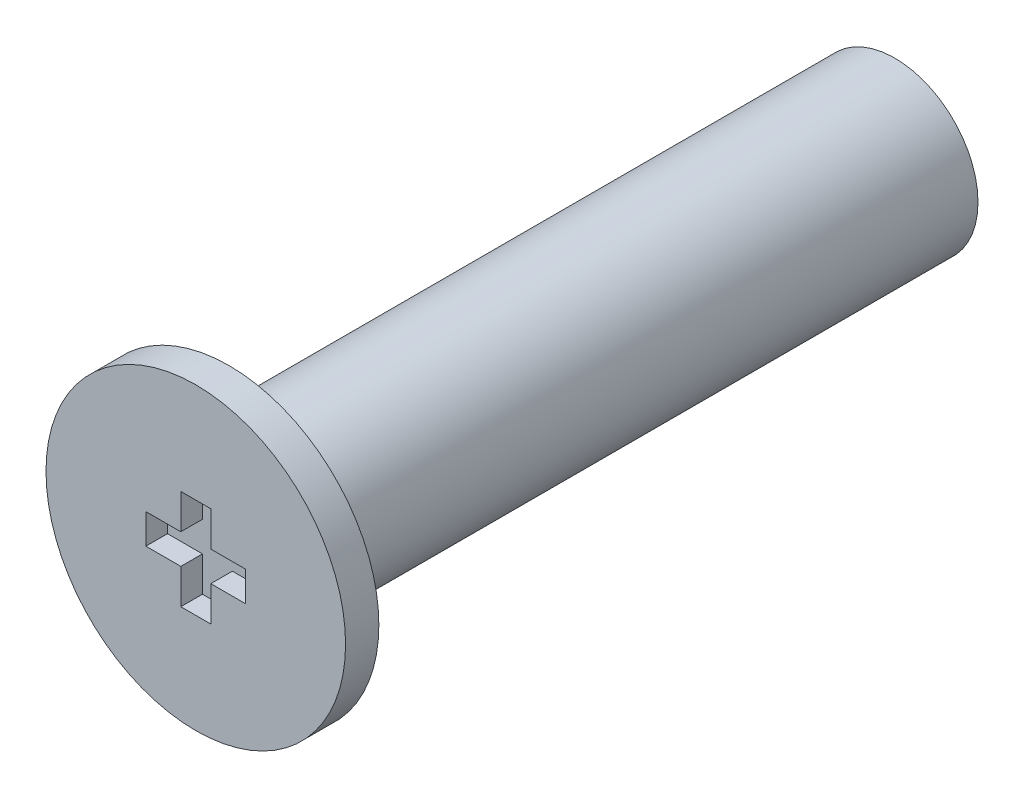
ISO-10303-21;
HEADER;
FILE_DESCRIPTION(('STEP AP214'),'2;1');
FILE_NAME('part.step','',(''),(''),'','','');
FILE_SCHEMA(('AUTOMOTIVE_DESIGN { 1 0 10303 214 1 1 1 1 }'));
ENDSEC;
DATA;
#1=APPLICATION_CONTEXT('core data for automotive mechanical design processes');
#2=APPLICATION_PROTOCOL_DEFINITION('international standard','automotive_design',2000,#1);
#3=PRODUCT_CONTEXT('',#1,'mechanical');
#4=PRODUCT('Part','Part','',(#3));
#5=PRODUCT_RELATED_PRODUCT_CATEGORY('part','',(#4));
#6=PRODUCT_DEFINITION_FORMATION('','',#4);
#7=PRODUCT_DEFINITION_CONTEXT('part definition',#1,'design');
#8=PRODUCT_DEFINITION('design','',#6,#7);
#9=PRODUCT_DEFINITION_SHAPE('','',#8);
#10=(LENGTH_UNIT() NAMED_UNIT(*) SI_UNIT(.MILLI.,.METRE.));
#11=(NAMED_UNIT(*) PLANE_ANGLE_UNIT() SI_UNIT($,.RADIAN.));
#12=(NAMED_UNIT(*) SI_UNIT($,.STERADIAN.) SOLID_ANGLE_UNIT());
#13=UNCERTAINTY_MEASURE_WITH_UNIT(LENGTH_MEASURE(1.E-05),#10,'distance_accuracy_value','');
#14=(GEOMETRIC_REPRESENTATION_CONTEXT(3) GLOBAL_UNCERTAINTY_ASSIGNED_CONTEXT((#13)) GLOBAL_UNIT_ASSIGNED_CONTEXT((#10,
#11,#12)) REPRESENTATION_CONTEXT('',''));
#15=CARTESIAN_POINT('',(0.,0.,0.));
#16=DIRECTION('',(0.,0.,1.));
#17=DIRECTION('',(1.,0.,0.));
#18=AXIS2_PLACEMENT_3D('',#15,#16,#17);
#19=CARTESIAN_POINT('',(0.,0.,-20.));
#20=DIRECTION('',(0.,0.,1.));
#21=DIRECTION('',(1.,0.,0.));
#22=AXIS2_PLACEMENT_3D('',#19,#20,#21);
#23=CYLINDRICAL_SURFACE('',#22,2.5);
#24=CARTESIAN_POINT('',(0.,0.,-20.));
#25=DIRECTION('',(0.,0.,1.));
#26=DIRECTION('',(1.,0.,0.));
#27=AXIS2_PLACEMENT_3D('',#24,#25,#26);
#28=CIRCLE('',#27,2.5);
#29=CARTESIAN_POINT('',(2.5,0.,-20.));
#30=VERTEX_POINT('',#29);
#31=EDGE_CURVE('E212',#30,#30,#28,.T.);
#32=ORIENTED_EDGE('',*,*,#31,.T.);
#33=EDGE_LOOP('',(#32));
#34=FACE_BOUND('',#33,.T.);
#35=CARTESIAN_POINT('',(0.,0.,0.));
#36=DIRECTION('',(0.,0.,1.));
#37=DIRECTION('',(1.,0.,0.));
#38=AXIS2_PLACEMENT_3D('',#35,#36,#37);
#39=CIRCLE('',#38,2.5);
#40=CARTESIAN_POINT('',(2.5,0.,0.));
#41=VERTEX_POINT('',#40);
#42=EDGE_CURVE('E208',#41,#41,#39,.T.);
#43=ORIENTED_EDGE('',*,*,#42,.F.);
#44=EDGE_LOOP('',(#43));
#45=FACE_BOUND('',#44,.T.);
#46=ADVANCED_FACE('F41',(#34,#45),#23,.T.);
#47=CARTESIAN_POINT('',(0.,0.,-20.));
#48=DIRECTION('',(0.,0.,1.));
#49=DIRECTION('',(1.,0.,0.));
#50=AXIS2_PLACEMENT_3D('',#47,#48,#49);
#51=PLANE('',#50);
#52=ORIENTED_EDGE('',*,*,#31,.F.);
#53=EDGE_LOOP('',(#52));
#54=FACE_BOUND('',#53,.T.);
#55=ADVANCED_FACE('F281',(#54),#51,.F.);
#56=CARTESIAN_POINT('',(0.,0.,0.));
#57=DIRECTION('',(0.,0.,1.));
#58=DIRECTION('',(1.,0.,0.));
#59=AXIS2_PLACEMENT_3D('',#56,#57,#58);
#60=PLANE('',#59);
#61=ORIENTED_EDGE('',*,*,#42,.T.);
#62=EDGE_LOOP('',(#61));
#63=FACE_BOUND('',#62,.T.);
#64=CARTESIAN_POINT('',(0.,0.,0.));
#65=DIRECTION('',(0.,0.,-1.));
#66=DIRECTION('',(-1.,0.,0.));
#67=AXIS2_PLACEMENT_3D('',#64,#65,#66);
#68=CIRCLE('',#67,4.5);
#69=CARTESIAN_POINT('',(-4.5,0.,0.));
#70=VERTEX_POINT('',#69);
#71=EDGE_CURVE('E210',#70,#70,#68,.T.);
#72=ORIENTED_EDGE('',*,*,#71,.T.);
#73=EDGE_LOOP('',(#72));
#74=FACE_BOUND('',#73,.T.);
#75=ADVANCED_FACE('F286',(#63,#74),#60,.F.);
#76=CARTESIAN_POINT('',(0.,0.,-2.));
#77=DIRECTION('',(0.,0.,-1.));
#78=DIRECTION('',(-1.,0.,0.));
#79=AXIS2_PLACEMENT_3D('',#76,#77,#78);
#80=CYLINDRICAL_SURFACE('',#79,4.5);
#81=ORIENTED_EDGE('',*,*,#71,.F.);
#82=EDGE_LOOP('',(#81));
#83=FACE_BOUND('',#82,.T.);
#84=CARTESIAN_POINT('',(0.,0.,1.));
#85=DIRECTION('',(0.,0.,-1.));
#86=DIRECTION('',(-1.,0.,0.));
#87=AXIS2_PLACEMENT_3D('',#84,#85,#86);
#88=CIRCLE('',#87,4.5);
#89=CARTESIAN_POINT('',(-4.5,0.,1.));
#90=VERTEX_POINT('',#89);
#91=EDGE_CURVE('E180',#90,#90,#88,.T.);
#92=ORIENTED_EDGE('',*,*,#91,.T.);
#93=EDGE_LOOP('',(#92));
#94=FACE_BOUND('',#93,.T.);
#95=ADVANCED_FACE('F300',(#83,#94),#80,.T.);
#96=CARTESIAN_POINT('',(4.5,0.,1.));
#97=DIRECTION('',(0.,0.,-1.));
#98=DIRECTION('',(-1.,0.,0.));
#99=AXIS2_PLACEMENT_3D('',#96,#97,#98);
#100=PLANE('',#99);
#101=DIRECTION('',(-1.,0.,0.));
#102=VECTOR('',#101,1.);
#103=CARTESIAN_POINT('',(4.5,-1.5,1.));
#104=LINE('',#103,#102);
#105=CARTESIAN_POINT('',(0.45,-1.5,1.));
#106=VERTEX_POINT('',#105);
#107=CARTESIAN_POINT('',(-0.45,-1.5,1.));
#108=VERTEX_POINT('',#107);
#109=EDGE_CURVE('E211',#106,#108,#104,.T.);
#110=ORIENTED_EDGE('',*,*,#109,.T.);
#111=DIRECTION('',(0.,1.,0.));
#112=VECTOR('',#111,1.);
#113=CARTESIAN_POINT('',(-0.45,0.,1.));
#114=LINE('',#113,#112);
#115=CARTESIAN_POINT('',(-0.45,-0.45,1.));
#116=VERTEX_POINT('',#115);
#117=EDGE_CURVE('E11',#108,#116,#114,.T.);
#118=ORIENTED_EDGE('',*,*,#117,.T.);
#119=DIRECTION('',(-1.,0.,0.));
#120=VECTOR('',#119,1.);
#121=CARTESIAN_POINT('',(4.5,-0.45,1.));
#122=LINE('',#121,#120);
#123=CARTESIAN_POINT('',(-1.5,-0.45,1.));
#124=VERTEX_POINT('',#123);
#125=EDGE_CURVE('E48',#116,#124,#122,.T.);
#126=ORIENTED_EDGE('',*,*,#125,.T.);
#127=DIRECTION('',(0.,1.,0.));
#128=VECTOR('',#127,1.);
#129=CARTESIAN_POINT('',(-1.5,0.,1.));
#130=LINE('',#129,#128);
#131=CARTESIAN_POINT('',(-1.5,0.45,1.));
#132=VERTEX_POINT('',#131);
#133=EDGE_CURVE('E245',#124,#132,#130,.T.);
#134=ORIENTED_EDGE('',*,*,#133,.T.);
#135=DIRECTION('',(1.,0.,0.));
#136=VECTOR('',#135,1.);
#137=CARTESIAN_POINT('',(4.5,0.45,1.));
#138=LINE('',#137,#136);
#139=CARTESIAN_POINT('',(-0.45,0.45,1.));
#140=VERTEX_POINT('',#139);
#141=EDGE_CURVE('E236',#132,#140,#138,.T.);
#142=ORIENTED_EDGE('',*,*,#141,.T.);
#143=DIRECTION('',(0.,1.,0.));
#144=VECTOR('',#143,1.);
#145=CARTESIAN_POINT('',(-0.45,0.,1.));
#146=LINE('',#145,#144);
#147=CARTESIAN_POINT('',(-0.45,1.5,1.));
#148=VERTEX_POINT('',#147);
#149=EDGE_CURVE('E237',#140,#148,#146,.T.);
#150=ORIENTED_EDGE('',*,*,#149,.T.);
#151=DIRECTION('',(1.,0.,0.));
#152=VECTOR('',#151,1.);
#153=CARTESIAN_POINT('',(4.5,1.5,1.));
#154=LINE('',#153,#152);
#155=CARTESIAN_POINT('',(0.45,1.5,1.));
#156=VERTEX_POINT('',#155);
#157=EDGE_CURVE('E231',#148,#156,#154,.T.);
#158=ORIENTED_EDGE('',*,*,#157,.T.);
#159=DIRECTION('',(0.,-1.,0.));
#160=VECTOR('',#159,1.);
#161=CARTESIAN_POINT('',(0.45,0.,1.));
#162=LINE('',#161,#160);
#163=CARTESIAN_POINT('',(0.45,0.45,1.));
#164=VERTEX_POINT('',#163);
#165=EDGE_CURVE('E229',#156,#164,#162,.T.);
#166=ORIENTED_EDGE('',*,*,#165,.T.);
#167=DIRECTION('',(1.,0.,0.));
#168=VECTOR('',#167,1.);
#169=CARTESIAN_POINT('',(4.5,0.45,1.));
#170=LINE('',#169,#168);
#171=CARTESIAN_POINT('',(1.5,0.45,1.));
#172=VERTEX_POINT('',#171);
#173=EDGE_CURVE('E230',#164,#172,#170,.T.);
#174=ORIENTED_EDGE('',*,*,#173,.T.);
#175=DIRECTION('',(0.,-1.,0.));
#176=VECTOR('',#175,1.);
#177=CARTESIAN_POINT('',(1.5,0.,1.));
#178=LINE('',#177,#176);
#179=CARTESIAN_POINT('',(1.5,-0.45,1.));
#180=VERTEX_POINT('',#179);
#181=EDGE_CURVE('E224',#172,#180,#178,.T.);
#182=ORIENTED_EDGE('',*,*,#181,.T.);
#183=DIRECTION('',(-1.,0.,0.));
#184=VECTOR('',#183,1.);
#185=CARTESIAN_POINT('',(4.5,-0.45,1.));
#186=LINE('',#185,#184);
#187=CARTESIAN_POINT('',(0.45,-0.45,1.));
#188=VERTEX_POINT('',#187);
#189=EDGE_CURVE('E222',#180,#188,#186,.T.);
#190=ORIENTED_EDGE('',*,*,#189,.T.);
#191=DIRECTION('',(0.,-1.,0.));
#192=VECTOR('',#191,1.);
#193=CARTESIAN_POINT('',(0.45,0.,1.));
#194=LINE('',#193,#192);
#195=EDGE_CURVE('E217',#188,#106,#194,.T.);
#196=ORIENTED_EDGE('',*,*,#195,.T.);
#197=EDGE_LOOP('',(#110,#118,#126,#134,#142,#150,#158,#166,#174,#182,#190,#196));
#198=FACE_BOUND('',#197,.T.);
#199=ORIENTED_EDGE('',*,*,#91,.F.);
#200=EDGE_LOOP('',(#199));
#201=FACE_BOUND('',#200,.T.);
#202=ADVANCED_FACE('F244',(#198,#201),#100,.F.);
#203=CARTESIAN_POINT('',(-0.45,-0.45,0.35));
#204=DIRECTION('',(-1.,0.,0.));
#205=DIRECTION('',(0.,0.,1.));
#206=AXIS2_PLACEMENT_3D('',#203,#204,#205);
#207=PLANE('',#206);
#208=DIRECTION('',(0.,0.,1.));
#209=VECTOR('',#208,1.);
#210=CARTESIAN_POINT('',(-0.45,-1.5,0.35));
#211=LINE('',#210,#209);
#212=CARTESIAN_POINT('',(-0.45,-1.5,0.35));
#213=VERTEX_POINT('',#212);
#214=EDGE_CURVE('E54',#213,#108,#211,.T.);
#215=ORIENTED_EDGE('',*,*,#214,.F.);
#216=DIRECTION('',(0.,-1.,0.));
#217=VECTOR('',#216,1.);
#218=CARTESIAN_POINT('',(-0.45,-0.45,0.35));
#219=LINE('',#218,#217);
#220=CARTESIAN_POINT('',(-0.45,-0.45,0.35));
#221=VERTEX_POINT('',#220);
#222=EDGE_CURVE('E129',#221,#213,#219,.T.);
#223=ORIENTED_EDGE('',*,*,#222,.F.);
#224=DIRECTION('',(0.,0.,1.));
#225=VECTOR('',#224,1.);
#226=CARTESIAN_POINT('',(-0.45,-0.45,0.35));
#227=LINE('',#226,#225);
#228=EDGE_CURVE('E171',#221,#116,#227,.T.);
#229=ORIENTED_EDGE('',*,*,#228,.T.);
#230=ORIENTED_EDGE('',*,*,#117,.F.);
#231=EDGE_LOOP('',(#215,#223,#229,#230));
#232=FACE_BOUND('',#231,.T.);
#233=ADVANCED_FACE('F127',(#232),#207,.F.);
#234=CARTESIAN_POINT('',(-1.5,-0.45,0.35));
#235=DIRECTION('',(0.,-1.,0.));
#236=DIRECTION('',(0.,0.,-1.));
#237=AXIS2_PLACEMENT_3D('',#234,#235,#236);
#238=PLANE('',#237);
#239=ORIENTED_EDGE('',*,*,#228,.F.);
#240=DIRECTION('',(1.,0.,0.));
#241=VECTOR('',#240,1.);
#242=CARTESIAN_POINT('',(-1.5,-0.45,0.35));
#243=LINE('',#242,#241);
#244=CARTESIAN_POINT('',(-1.5,-0.45,0.35));
#245=VERTEX_POINT('',#244);
#246=EDGE_CURVE('E131',#245,#221,#243,.T.);
#247=ORIENTED_EDGE('',*,*,#246,.F.);
#248=DIRECTION('',(0.,0.,1.));
#249=VECTOR('',#248,1.);
#250=CARTESIAN_POINT('',(-1.5,-0.45,0.35));
#251=LINE('',#250,#249);
#252=EDGE_CURVE('E177',#245,#124,#251,.T.);
#253=ORIENTED_EDGE('',*,*,#252,.T.);
#254=ORIENTED_EDGE('',*,*,#125,.F.);
#255=EDGE_LOOP('',(#239,#247,#253,#254));
#256=FACE_BOUND('',#255,.T.);
#257=ADVANCED_FACE('F273',(#256),#238,.F.);
#258=CARTESIAN_POINT('',(-1.5,0.45,0.35));
#259=DIRECTION('',(-1.,0.,0.));
#260=DIRECTION('',(0.,0.,1.));
#261=AXIS2_PLACEMENT_3D('',#258,#259,#260);
#262=PLANE('',#261);
#263=ORIENTED_EDGE('',*,*,#252,.F.);
#264=DIRECTION('',(0.,-1.,0.));
#265=VECTOR('',#264,1.);
#266=CARTESIAN_POINT('',(-1.5,0.45,0.35));
#267=LINE('',#266,#265);
#268=CARTESIAN_POINT('',(-1.5,0.45,0.35));
#269=VERTEX_POINT('',#268);
#270=EDGE_CURVE('E175',#269,#245,#267,.T.);
#271=ORIENTED_EDGE('',*,*,#270,.F.);
#272=DIRECTION('',(0.,0.,1.));
#273=VECTOR('',#272,1.);
#274=CARTESIAN_POINT('',(-1.5,0.45,0.35));
#275=LINE('',#274,#273);
#276=EDGE_CURVE('E179',#269,#132,#275,.T.);
#277=ORIENTED_EDGE('',*,*,#276,.T.);
#278=ORIENTED_EDGE('',*,*,#133,.F.);
#279=EDGE_LOOP('',(#263,#271,#277,#278));
#280=FACE_BOUND('',#279,.T.);
#281=ADVANCED_FACE('F275',(#280),#262,.F.);
#282=CARTESIAN_POINT('',(-0.45,0.45,0.35));
#283=DIRECTION('',(0.,1.,0.));
#284=DIRECTION('',(0.,0.,1.));
#285=AXIS2_PLACEMENT_3D('',#282,#283,#284);
#286=PLANE('',#285);
#287=ORIENTED_EDGE('',*,*,#276,.F.);
#288=DIRECTION('',(-1.,0.,0.));
#289=VECTOR('',#288,1.);
#290=CARTESIAN_POINT('',(-0.45,0.45,0.35));
#291=LINE('',#290,#289);
#292=CARTESIAN_POINT('',(-0.45,0.45,0.35));
#293=VERTEX_POINT('',#292);
#294=EDGE_CURVE('E168',#293,#269,#291,.T.);
#295=ORIENTED_EDGE('',*,*,#294,.F.);
#296=DIRECTION('',(0.,0.,1.));
#297=VECTOR('',#296,1.);
#298=CARTESIAN_POINT('',(-0.45,0.45,0.35));
#299=LINE('',#298,#297);
#300=EDGE_CURVE('E181',#293,#140,#299,.T.);
#301=ORIENTED_EDGE('',*,*,#300,.T.);
#302=ORIENTED_EDGE('',*,*,#141,.F.);
#303=EDGE_LOOP('',(#287,#295,#301,#302));
#304=FACE_BOUND('',#303,.T.);
#305=ADVANCED_FACE('F269',(#304),#286,.F.);
#306=CARTESIAN_POINT('',(-0.45,1.5,0.35));
#307=DIRECTION('',(-1.,0.,0.));
#308=DIRECTION('',(0.,0.,1.));
#309=AXIS2_PLACEMENT_3D('',#306,#307,#308);
#310=PLANE('',#309);
#311=ORIENTED_EDGE('',*,*,#300,.F.);
#312=DIRECTION('',(0.,-1.,0.));
#313=VECTOR('',#312,1.);
#314=CARTESIAN_POINT('',(-0.45,1.5,0.35));
#315=LINE('',#314,#313);
#316=CARTESIAN_POINT('',(-0.45,1.5,0.35));
#317=VERTEX_POINT('',#316);
#318=EDGE_CURVE('E166',#317,#293,#315,.T.);
#319=ORIENTED_EDGE('',*,*,#318,.F.);
#320=DIRECTION('',(0.,0.,1.));
#321=VECTOR('',#320,1.);
#322=CARTESIAN_POINT('',(-0.45,1.5,0.35));
#323=LINE('',#322,#321);
#324=EDGE_CURVE('E188',#317,#148,#323,.T.);
#325=ORIENTED_EDGE('',*,*,#324,.T.);
#326=ORIENTED_EDGE('',*,*,#149,.F.);
#327=EDGE_LOOP('',(#311,#319,#325,#326));
#328=FACE_BOUND('',#327,.T.);
#329=ADVANCED_FACE('F266',(#328),#310,.F.);
#330=CARTESIAN_POINT('',(0.45,1.5,0.35));
#331=DIRECTION('',(0.,1.,0.));
#332=DIRECTION('',(0.,0.,1.));
#333=AXIS2_PLACEMENT_3D('',#330,#331,#332);
#334=PLANE('',#333);
#335=ORIENTED_EDGE('',*,*,#324,.F.);
#336=DIRECTION('',(-1.,0.,0.));
#337=VECTOR('',#336,1.);
#338=CARTESIAN_POINT('',(0.45,1.5,0.35));
#339=LINE('',#338,#337);
#340=CARTESIAN_POINT('',(0.45,1.5,0.35));
#341=VERTEX_POINT('',#340);
#342=EDGE_CURVE('E164',#341,#317,#339,.T.);
#343=ORIENTED_EDGE('',*,*,#342,.F.);
#344=DIRECTION('',(0.,0.,1.));
#345=VECTOR('',#344,1.);
#346=CARTESIAN_POINT('',(0.45,1.5,0.35));
#347=LINE('',#346,#345);
#348=EDGE_CURVE('E189',#341,#156,#347,.T.);
#349=ORIENTED_EDGE('',*,*,#348,.T.);
#350=ORIENTED_EDGE('',*,*,#157,.F.);
#351=EDGE_LOOP('',(#335,#343,#349,#350));
#352=FACE_BOUND('',#351,.T.);
#353=ADVANCED_FACE('F261',(#352),#334,.F.);
#354=CARTESIAN_POINT('',(0.45,0.45,0.35));
#355=DIRECTION('',(1.,0.,0.));
#356=DIRECTION('',(0.,0.,-1.));
#357=AXIS2_PLACEMENT_3D('',#354,#355,#356);
#358=PLANE('',#357);
#359=ORIENTED_EDGE('',*,*,#348,.F.);
#360=DIRECTION('',(0.,1.,0.));
#361=VECTOR('',#360,1.);
#362=CARTESIAN_POINT('',(0.45,0.45,0.35));
#363=LINE('',#362,#361);
#364=CARTESIAN_POINT('',(0.45,0.45,0.35));
#365=VERTEX_POINT('',#364);
#366=EDGE_CURVE('E158',#365,#341,#363,.T.);
#367=ORIENTED_EDGE('',*,*,#366,.F.);
#368=DIRECTION('',(0.,0.,1.));
#369=VECTOR('',#368,1.);
#370=CARTESIAN_POINT('',(0.45,0.45,0.35));
#371=LINE('',#370,#369);
#372=EDGE_CURVE('E195',#365,#164,#371,.T.);
#373=ORIENTED_EDGE('',*,*,#372,.T.);
#374=ORIENTED_EDGE('',*,*,#165,.F.);
#375=EDGE_LOOP('',(#359,#367,#373,#374));
#376=FACE_BOUND('',#375,.T.);
#377=ADVANCED_FACE('F263',(#376),#358,.F.);
#378=CARTESIAN_POINT('',(1.5,0.45,0.35));
#379=DIRECTION('',(0.,1.,0.));
#380=DIRECTION('',(0.,0.,1.));
#381=AXIS2_PLACEMENT_3D('',#378,#379,#380);
#382=PLANE('',#381);
#383=ORIENTED_EDGE('',*,*,#372,.F.);
#384=DIRECTION('',(-1.,0.,0.));
#385=VECTOR('',#384,1.);
#386=CARTESIAN_POINT('',(1.5,0.45,0.35));
#387=LINE('',#386,#385);
#388=CARTESIAN_POINT('',(1.5,0.45,0.35));
#389=VERTEX_POINT('',#388);
#390=EDGE_CURVE('E160',#389,#365,#387,.T.);
#391=ORIENTED_EDGE('',*,*,#390,.F.);
#392=DIRECTION('',(0.,0.,1.));
#393=VECTOR('',#392,1.);
#394=CARTESIAN_POINT('',(1.5,0.45,0.35));
#395=LINE('',#394,#393);
#396=EDGE_CURVE('E194',#389,#172,#395,.T.);
#397=ORIENTED_EDGE('',*,*,#396,.T.);
#398=ORIENTED_EDGE('',*,*,#173,.F.);
#399=EDGE_LOOP('',(#383,#391,#397,#398));
#400=FACE_BOUND('',#399,.T.);
#401=ADVANCED_FACE('F257',(#400),#382,.F.);
#402=CARTESIAN_POINT('',(1.5,-0.45,0.35));
#403=DIRECTION('',(1.,0.,0.));
#404=DIRECTION('',(0.,0.,-1.));
#405=AXIS2_PLACEMENT_3D('',#402,#403,#404);
#406=PLANE('',#405);
#407=ORIENTED_EDGE('',*,*,#396,.F.);
#408=DIRECTION('',(0.,1.,0.));
#409=VECTOR('',#408,1.);
#410=CARTESIAN_POINT('',(1.5,-0.45,0.35));
#411=LINE('',#410,#409);
#412=CARTESIAN_POINT('',(1.5,-0.45,0.35));
#413=VERTEX_POINT('',#412);
#414=EDGE_CURVE('E153',#413,#389,#411,.T.);
#415=ORIENTED_EDGE('',*,*,#414,.F.);
#416=DIRECTION('',(0.,0.,1.));
#417=VECTOR('',#416,1.);
#418=CARTESIAN_POINT('',(1.5,-0.45,0.35));
#419=LINE('',#418,#417);
#420=EDGE_CURVE('E198',#413,#180,#419,.T.);
#421=ORIENTED_EDGE('',*,*,#420,.T.);
#422=ORIENTED_EDGE('',*,*,#181,.F.);
#423=EDGE_LOOP('',(#407,#415,#421,#422));
#424=FACE_BOUND('',#423,.T.);
#425=ADVANCED_FACE('F253',(#424),#406,.F.);
#426=CARTESIAN_POINT('',(0.45,-0.45,0.35));
#427=DIRECTION('',(0.,-1.,0.));
#428=DIRECTION('',(0.,0.,-1.));
#429=AXIS2_PLACEMENT_3D('',#426,#427,#428);
#430=PLANE('',#429);
#431=ORIENTED_EDGE('',*,*,#420,.F.);
#432=DIRECTION('',(1.,0.,0.));
#433=VECTOR('',#432,1.);
#434=CARTESIAN_POINT('',(0.45,-0.45,0.35));
#435=LINE('',#434,#433);
#436=CARTESIAN_POINT('',(0.45,-0.45,0.35));
#437=VERTEX_POINT('',#436);
#438=EDGE_CURVE('E151',#437,#413,#435,.T.);
#439=ORIENTED_EDGE('',*,*,#438,.F.);
#440=DIRECTION('',(0.,0.,1.));
#441=VECTOR('',#440,1.);
#442=CARTESIAN_POINT('',(0.45,-0.45,0.35));
#443=LINE('',#442,#441);
#444=EDGE_CURVE('E201',#437,#188,#443,.T.);
#445=ORIENTED_EDGE('',*,*,#444,.T.);
#446=ORIENTED_EDGE('',*,*,#189,.F.);
#447=EDGE_LOOP('',(#431,#439,#445,#446));
#448=FACE_BOUND('',#447,.T.);
#449=ADVANCED_FACE('F255',(#448),#430,.F.);
#450=CARTESIAN_POINT('',(0.45,-1.5,0.35));
#451=DIRECTION('',(1.,0.,0.));
#452=DIRECTION('',(0.,0.,-1.));
#453=AXIS2_PLACEMENT_3D('',#450,#451,#452);
#454=PLANE('',#453);
#455=ORIENTED_EDGE('',*,*,#444,.F.);
#456=DIRECTION('',(0.,1.,0.));
#457=VECTOR('',#456,1.);
#458=CARTESIAN_POINT('',(0.45,-1.5,0.35));
#459=LINE('',#458,#457);
#460=CARTESIAN_POINT('',(0.45,-1.5,0.35));
#461=VERTEX_POINT('',#460);
#462=EDGE_CURVE('E142',#461,#437,#459,.T.);
#463=ORIENTED_EDGE('',*,*,#462,.F.);
#464=DIRECTION('',(0.,0.,1.));
#465=VECTOR('',#464,1.);
#466=CARTESIAN_POINT('',(0.45,-1.5,0.35));
#467=LINE('',#466,#465);
#468=EDGE_CURVE('E134',#461,#106,#467,.T.);
#469=ORIENTED_EDGE('',*,*,#468,.T.);
#470=ORIENTED_EDGE('',*,*,#195,.F.);
#471=EDGE_LOOP('',(#455,#463,#469,#470));
#472=FACE_BOUND('',#471,.T.);
#473=ADVANCED_FACE('F248',(#472),#454,.F.);
#474=CARTESIAN_POINT('',(-0.45,-1.5,0.35));
#475=DIRECTION('',(0.,-1.,0.));
#476=DIRECTION('',(0.,0.,-1.));
#477=AXIS2_PLACEMENT_3D('',#474,#475,#476);
#478=PLANE('',#477);
#479=ORIENTED_EDGE('',*,*,#468,.F.);
#480=DIRECTION('',(1.,0.,0.));
#481=VECTOR('',#480,1.);
#482=CARTESIAN_POINT('',(-0.45,-1.5,0.35));
#483=LINE('',#482,#481);
#484=EDGE_CURVE('E140',#213,#461,#483,.T.);
#485=ORIENTED_EDGE('',*,*,#484,.F.);
#486=ORIENTED_EDGE('',*,*,#214,.T.);
#487=ORIENTED_EDGE('',*,*,#109,.F.);
#488=EDGE_LOOP('',(#479,#485,#486,#487));
#489=FACE_BOUND('',#488,.T.);
#490=ADVANCED_FACE('F139',(#489),#478,.F.);
#491=CARTESIAN_POINT('',(0.,0.,0.35));
#492=DIRECTION('',(0.,0.,1.));
#493=DIRECTION('',(1.,0.,0.));
#494=AXIS2_PLACEMENT_3D('',#491,#492,#493);
#495=PLANE('',#494);
#496=ORIENTED_EDGE('',*,*,#222,.T.);
#497=ORIENTED_EDGE('',*,*,#484,.T.);
#498=ORIENTED_EDGE('',*,*,#462,.T.);
#499=ORIENTED_EDGE('',*,*,#438,.T.);
#500=ORIENTED_EDGE('',*,*,#414,.T.);
#501=ORIENTED_EDGE('',*,*,#390,.T.);
#502=ORIENTED_EDGE('',*,*,#366,.T.);
#503=ORIENTED_EDGE('',*,*,#342,.T.);
#504=ORIENTED_EDGE('',*,*,#318,.T.);
#505=ORIENTED_EDGE('',*,*,#294,.T.);
#506=ORIENTED_EDGE('',*,*,#270,.T.);
#507=ORIENTED_EDGE('',*,*,#246,.T.);
#508=EDGE_LOOP('',(#496,#497,#498,#499,#500,#501,#502,#503,#504,#505,#506,#507));
#509=FACE_BOUND('',#508,.T.);
#510=ADVANCED_FACE('F144',(#509),#495,.T.);
#511=CLOSED_SHELL('',(#46,#55,#75,#95,#202,#233,#257,#281,#305,#329,#353,#377,#401,#425,#449,
#473,#490,#510));
#512=MANIFOLD_SOLID_BREP('B2',#511);
#513=ADVANCED_BREP_SHAPE_REPRESENTATION('',(#18,#512),#14);
#514=SHAPE_DEFINITION_REPRESENTATION(#9,#513);
ENDSEC;
END-ISO-10303-21;
